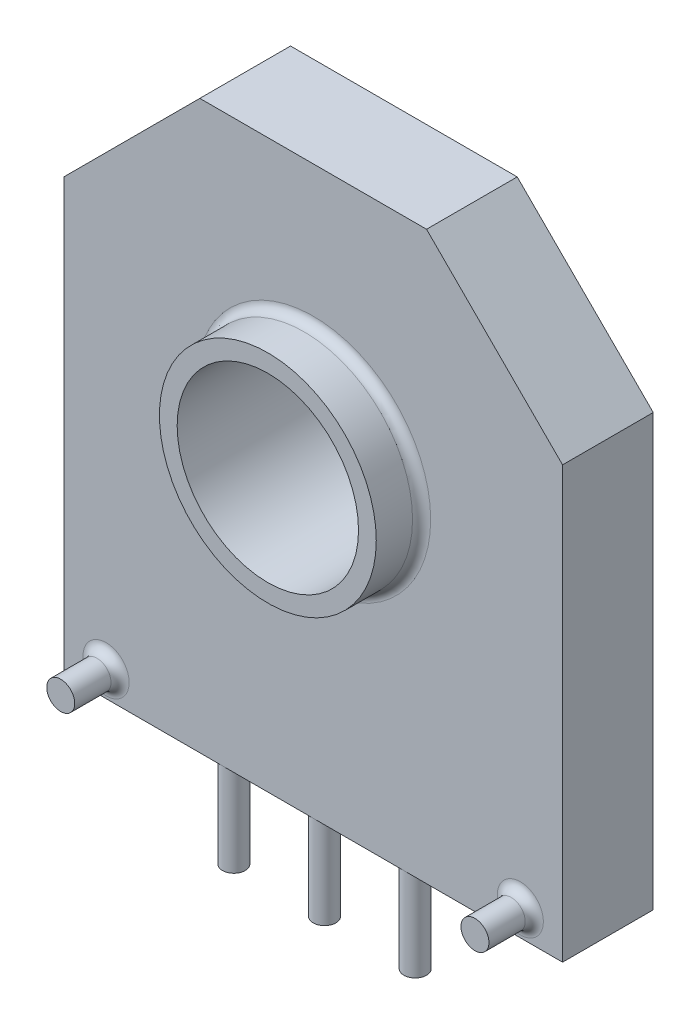
ISO-10303-21;
HEADER;
FILE_DESCRIPTION(('STEP AP214'),'2;1');
FILE_NAME('part.step','',(''),(''),'','','');
FILE_SCHEMA(('AUTOMOTIVE_DESIGN { 1 0 10303 214 1 1 1 1 }'));
ENDSEC;
DATA;
#1=APPLICATION_CONTEXT('core data for automotive mechanical design processes');
#2=APPLICATION_PROTOCOL_DEFINITION('international standard','automotive_design',2000,#1);
#3=PRODUCT_CONTEXT('',#1,'mechanical');
#4=PRODUCT('Part','Part','',(#3));
#5=PRODUCT_RELATED_PRODUCT_CATEGORY('part','',(#4));
#6=PRODUCT_DEFINITION_FORMATION('','',#4);
#7=PRODUCT_DEFINITION_CONTEXT('part definition',#1,'design');
#8=PRODUCT_DEFINITION('design','',#6,#7);
#9=PRODUCT_DEFINITION_SHAPE('','',#8);
#10=(LENGTH_UNIT() NAMED_UNIT(*) SI_UNIT(.MILLI.,.METRE.));
#11=(NAMED_UNIT(*) PLANE_ANGLE_UNIT() SI_UNIT($,.RADIAN.));
#12=(NAMED_UNIT(*) SI_UNIT($,.STERADIAN.) SOLID_ANGLE_UNIT());
#13=UNCERTAINTY_MEASURE_WITH_UNIT(LENGTH_MEASURE(1.E-05),#10,'distance_accuracy_value','');
#14=(GEOMETRIC_REPRESENTATION_CONTEXT(3) GLOBAL_UNCERTAINTY_ASSIGNED_CONTEXT((#13)) GLOBAL_UNIT_ASSIGNED_CONTEXT((#10,
#11,#12)) REPRESENTATION_CONTEXT('',''));
#15=CARTESIAN_POINT('',(0.,0.,0.));
#16=DIRECTION('',(0.,0.,1.));
#17=DIRECTION('',(1.,0.,0.));
#18=AXIS2_PLACEMENT_3D('',#15,#16,#17);
#19=CARTESIAN_POINT('',(0.,0.,2.));
#20=DIRECTION('',(0.,0.,1.));
#21=DIRECTION('',(1.,0.,0.));
#22=AXIS2_PLACEMENT_3D('',#19,#20,#21);
#23=PLANE('',#22);
#24=CARTESIAN_POINT('',(4.56778137063752,-6.43744793052759,2.));
#25=DIRECTION('',(0.,0.,1.));
#26=DIRECTION('',(1.,0.,0.));
#27=AXIS2_PLACEMENT_3D('',#24,#25,#26);
#28=CIRCLE('',#27,0.508853544633855);
#29=CARTESIAN_POINT('',(5.07663491527137,-6.43744793052759,2.));
#30=VERTEX_POINT('',#29);
#31=EDGE_CURVE('E159',#30,#30,#28,.F.);
#32=ORIENTED_EDGE('',*,*,#31,.T.);
#33=EDGE_LOOP('',(#32));
#34=FACE_BOUND('',#33,.T.);
#35=CARTESIAN_POINT('',(-4.56778137063752,-6.43744793052759,2.));
#36=DIRECTION('',(0.,0.,1.));
#37=DIRECTION('',(1.,0.,0.));
#38=AXIS2_PLACEMENT_3D('',#35,#36,#37);
#39=CIRCLE('',#38,0.508853544633855);
#40=CARTESIAN_POINT('',(-4.05892782600366,-6.43744793052759,2.));
#41=VERTEX_POINT('',#40);
#42=EDGE_CURVE('E156',#41,#41,#39,.F.);
#43=ORIENTED_EDGE('',*,*,#42,.T.);
#44=EDGE_LOOP('',(#43));
#45=FACE_BOUND('',#44,.T.);
#46=CARTESIAN_POINT('',(0.,0.,2.));
#47=DIRECTION('',(0.,0.,1.));
#48=DIRECTION('',(1.,0.,0.));
#49=AXIS2_PLACEMENT_3D('',#46,#47,#48);
#50=CIRCLE('',#49,2.59147336487381);
#51=CARTESIAN_POINT('',(2.59147336487381,0.,2.));
#52=VERTEX_POINT('',#51);
#53=EDGE_CURVE('E153',#52,#52,#50,.F.);
#54=ORIENTED_EDGE('',*,*,#53,.T.);
#55=EDGE_LOOP('',(#54));
#56=FACE_BOUND('',#55,.T.);
#57=DIRECTION('',(0.,1.,0.));
#58=VECTOR('',#57,1.);
#59=CARTESIAN_POINT('',(5.5,2.50000000000003,2.));
#60=LINE('',#59,#58);
#61=CARTESIAN_POINT('',(5.5,-7.,2.));
#62=VERTEX_POINT('',#61);
#63=CARTESIAN_POINT('',(5.5,2.50000000000003,2.));
#64=VERTEX_POINT('',#63);
#65=EDGE_CURVE('E141',#62,#64,#60,.T.);
#66=ORIENTED_EDGE('',*,*,#65,.T.);
#67=DIRECTION('',(-0.707106781186552,0.707106781186544,0.));
#68=VECTOR('',#67,1.);
#69=CARTESIAN_POINT('',(2.5,5.5,2.));
#70=LINE('',#69,#68);
#71=CARTESIAN_POINT('',(2.5,5.5,2.));
#72=VERTEX_POINT('',#71);
#73=EDGE_CURVE('E89',#64,#72,#70,.T.);
#74=ORIENTED_EDGE('',*,*,#73,.T.);
#75=DIRECTION('',(-1.,0.,0.));
#76=VECTOR('',#75,1.);
#77=CARTESIAN_POINT('',(2.5,5.5,2.));
#78=LINE('',#77,#76);
#79=CARTESIAN_POINT('',(-2.5,5.5,2.));
#80=VERTEX_POINT('',#79);
#81=EDGE_CURVE('E105',#72,#80,#78,.T.);
#82=ORIENTED_EDGE('',*,*,#81,.T.);
#83=DIRECTION('',(-0.707106781186542,-0.707106781186553,0.));
#84=VECTOR('',#83,1.);
#85=CARTESIAN_POINT('',(-2.5,5.5,2.));
#86=LINE('',#85,#84);
#87=CARTESIAN_POINT('',(-5.5,2.49999999999995,2.));
#88=VERTEX_POINT('',#87);
#89=EDGE_CURVE('E98',#80,#88,#86,.T.);
#90=ORIENTED_EDGE('',*,*,#89,.T.);
#91=DIRECTION('',(0.,-1.,0.));
#92=VECTOR('',#91,1.);
#93=CARTESIAN_POINT('',(-5.5,2.49999999999995,2.));
#94=LINE('',#93,#92);
#95=CARTESIAN_POINT('',(-5.5,-7.,2.));
#96=VERTEX_POINT('',#95);
#97=EDGE_CURVE('E102',#88,#96,#94,.T.);
#98=ORIENTED_EDGE('',*,*,#97,.T.);
#99=DIRECTION('',(1.,0.,0.));
#100=VECTOR('',#99,1.);
#101=CARTESIAN_POINT('',(-5.5,-7.,2.));
#102=LINE('',#101,#100);
#103=CARTESIAN_POINT('',(-2.00000000000001,-7.,1.99999999999997));
#104=VERTEX_POINT('',#103);
#105=EDGE_CURVE('E126',#96,#104,#102,.T.);
#106=ORIENTED_EDGE('',*,*,#105,.T.);
#107=CARTESIAN_POINT('',(0.,-7.,2.));
#108=VERTEX_POINT('',#107);
#109=EDGE_CURVE('E124',#104,#108,#102,.T.);
#110=ORIENTED_EDGE('',*,*,#109,.T.);
#111=CARTESIAN_POINT('',(2.,-7.,2.00000000000003));
#112=VERTEX_POINT('',#111);
#113=EDGE_CURVE('E122',#108,#112,#102,.T.);
#114=ORIENTED_EDGE('',*,*,#113,.T.);
#115=EDGE_CURVE('E51',#112,#62,#102,.T.);
#116=ORIENTED_EDGE('',*,*,#115,.T.);
#117=EDGE_LOOP('',(#66,#74,#82,#90,#98,#106,#110,#114,#116));
#118=FACE_BOUND('',#117,.T.);
#119=ADVANCED_FACE('F34',(#34,#45,#56,#118),#23,.T.);
#120=CARTESIAN_POINT('',(0.,0.,0.));
#121=DIRECTION('',(0.,0.,1.));
#122=DIRECTION('',(1.,0.,0.));
#123=AXIS2_PLACEMENT_3D('',#120,#121,#122);
#124=PLANE('',#123);
#125=DIRECTION('',(0.,1.,0.));
#126=VECTOR('',#125,1.);
#127=CARTESIAN_POINT('',(5.5,2.50000000000003,0.));
#128=LINE('',#127,#126);
#129=CARTESIAN_POINT('',(5.5,-7.,0.));
#130=VERTEX_POINT('',#129);
#131=CARTESIAN_POINT('',(5.5,2.50000000000003,0.));
#132=VERTEX_POINT('',#131);
#133=EDGE_CURVE('E129',#130,#132,#128,.T.);
#134=ORIENTED_EDGE('',*,*,#133,.F.);
#135=DIRECTION('',(1.,0.,0.));
#136=VECTOR('',#135,1.);
#137=CARTESIAN_POINT('',(0.,-7.,0.));
#138=LINE('',#137,#136);
#139=CARTESIAN_POINT('',(-5.5,-7.,0.));
#140=VERTEX_POINT('',#139);
#141=EDGE_CURVE('E76',#140,#130,#138,.T.);
#142=ORIENTED_EDGE('',*,*,#141,.F.);
#143=DIRECTION('',(0.,-1.,0.));
#144=VECTOR('',#143,1.);
#145=CARTESIAN_POINT('',(-5.5,2.49999999999995,0.));
#146=LINE('',#145,#144);
#147=CARTESIAN_POINT('',(-5.5,2.49999999999995,0.));
#148=VERTEX_POINT('',#147);
#149=EDGE_CURVE('E138',#148,#140,#146,.T.);
#150=ORIENTED_EDGE('',*,*,#149,.F.);
#151=DIRECTION('',(-0.707106781186542,-0.707106781186553,0.));
#152=VECTOR('',#151,1.);
#153=CARTESIAN_POINT('',(-2.5,5.5,0.));
#154=LINE('',#153,#152);
#155=CARTESIAN_POINT('',(-2.5,5.5,0.));
#156=VERTEX_POINT('',#155);
#157=EDGE_CURVE('E114',#156,#148,#154,.T.);
#158=ORIENTED_EDGE('',*,*,#157,.F.);
#159=DIRECTION('',(-1.,0.,0.));
#160=VECTOR('',#159,1.);
#161=CARTESIAN_POINT('',(2.5,5.5,0.));
#162=LINE('',#161,#160);
#163=CARTESIAN_POINT('',(2.5,5.5,0.));
#164=VERTEX_POINT('',#163);
#165=EDGE_CURVE('E135',#164,#156,#162,.T.);
#166=ORIENTED_EDGE('',*,*,#165,.F.);
#167=DIRECTION('',(-0.707106781186552,0.707106781186544,0.));
#168=VECTOR('',#167,1.);
#169=CARTESIAN_POINT('',(2.5,5.5,0.));
#170=LINE('',#169,#168);
#171=EDGE_CURVE('E132',#132,#164,#170,.T.);
#172=ORIENTED_EDGE('',*,*,#171,.F.);
#173=EDGE_LOOP('',(#134,#142,#150,#158,#166,#172));
#174=FACE_BOUND('',#173,.T.);
#175=CARTESIAN_POINT('',(0.,0.,0.));
#176=DIRECTION('',(0.,0.,1.));
#177=DIRECTION('',(1.,0.,0.));
#178=AXIS2_PLACEMENT_3D('',#175,#176,#177);
#179=CIRCLE('',#178,2.);
#180=CARTESIAN_POINT('',(2.,0.,0.));
#181=VERTEX_POINT('',#180);
#182=EDGE_CURVE('E133',#181,#181,#179,.T.);
#183=ORIENTED_EDGE('',*,*,#182,.T.);
#184=EDGE_LOOP('',(#183));
#185=FACE_BOUND('',#184,.T.);
#186=ADVANCED_FACE('F182',(#174,#185),#124,.F.);
#187=CARTESIAN_POINT('',(5.5,2.50000000000003,2.));
#188=DIRECTION('',(-1.,0.,0.));
#189=DIRECTION('',(0.,0.,1.));
#190=AXIS2_PLACEMENT_3D('',#187,#188,#189);
#191=PLANE('',#190);
#192=ORIENTED_EDGE('',*,*,#133,.T.);
#193=DIRECTION('',(0.,0.,-1.));
#194=VECTOR('',#193,1.);
#195=CARTESIAN_POINT('',(5.5,2.50000000000003,2.));
#196=LINE('',#195,#194);
#197=EDGE_CURVE('E148',#64,#132,#196,.T.);
#198=ORIENTED_EDGE('',*,*,#197,.F.);
#199=ORIENTED_EDGE('',*,*,#65,.F.);
#200=DIRECTION('',(0.,0.,-1.));
#201=VECTOR('',#200,1.);
#202=CARTESIAN_POINT('',(5.5,-7.,2.));
#203=LINE('',#202,#201);
#204=EDGE_CURVE('E128',#62,#130,#203,.T.);
#205=ORIENTED_EDGE('',*,*,#204,.T.);
#206=EDGE_LOOP('',(#192,#198,#199,#205));
#207=FACE_BOUND('',#206,.T.);
#208=ADVANCED_FACE('F188',(#207),#191,.F.);
#209=CARTESIAN_POINT('',(2.5,5.5,2.));
#210=DIRECTION('',(-0.707106781186543,-0.707106781186552,0.));
#211=DIRECTION('',(0.707106781186552,-0.707106781186543,0.));
#212=AXIS2_PLACEMENT_3D('',#209,#210,#211);
#213=PLANE('',#212);
#214=ORIENTED_EDGE('',*,*,#171,.T.);
#215=DIRECTION('',(0.,0.,-1.));
#216=VECTOR('',#215,1.);
#217=CARTESIAN_POINT('',(2.5,5.5,2.));
#218=LINE('',#217,#216);
#219=EDGE_CURVE('E145',#72,#164,#218,.T.);
#220=ORIENTED_EDGE('',*,*,#219,.F.);
#221=ORIENTED_EDGE('',*,*,#73,.F.);
#222=ORIENTED_EDGE('',*,*,#197,.T.);
#223=EDGE_LOOP('',(#214,#220,#221,#222));
#224=FACE_BOUND('',#223,.T.);
#225=ADVANCED_FACE('F205',(#224),#213,.F.);
#226=CARTESIAN_POINT('',(2.5,5.5,2.));
#227=DIRECTION('',(0.,-1.,0.));
#228=DIRECTION('',(1.,0.,0.));
#229=AXIS2_PLACEMENT_3D('',#226,#227,#228);
#230=PLANE('',#229);
#231=ORIENTED_EDGE('',*,*,#165,.T.);
#232=DIRECTION('',(0.,0.,-1.));
#233=VECTOR('',#232,1.);
#234=CARTESIAN_POINT('',(-2.5,5.5,2.));
#235=LINE('',#234,#233);
#236=EDGE_CURVE('E116',#80,#156,#235,.T.);
#237=ORIENTED_EDGE('',*,*,#236,.F.);
#238=ORIENTED_EDGE('',*,*,#81,.F.);
#239=ORIENTED_EDGE('',*,*,#219,.T.);
#240=EDGE_LOOP('',(#231,#237,#238,#239));
#241=FACE_BOUND('',#240,.T.);
#242=ADVANCED_FACE('F202',(#241),#230,.F.);
#243=CARTESIAN_POINT('',(-2.5,5.5,2.));
#244=DIRECTION('',(0.707106781186554,-0.707106781186542,0.));
#245=DIRECTION('',(0.707106781186542,0.707106781186554,0.));
#246=AXIS2_PLACEMENT_3D('',#243,#244,#245);
#247=PLANE('',#246);
#248=ORIENTED_EDGE('',*,*,#157,.T.);
#249=DIRECTION('',(0.,0.,-1.));
#250=VECTOR('',#249,1.);
#251=CARTESIAN_POINT('',(-5.5,2.49999999999995,2.));
#252=LINE('',#251,#250);
#253=EDGE_CURVE('E111',#88,#148,#252,.T.);
#254=ORIENTED_EDGE('',*,*,#253,.F.);
#255=ORIENTED_EDGE('',*,*,#89,.F.);
#256=ORIENTED_EDGE('',*,*,#236,.T.);
#257=EDGE_LOOP('',(#248,#254,#255,#256));
#258=FACE_BOUND('',#257,.T.);
#259=ADVANCED_FACE('F112',(#258),#247,.F.);
#260=CARTESIAN_POINT('',(-5.5,2.49999999999995,2.));
#261=DIRECTION('',(1.,0.,0.));
#262=DIRECTION('',(0.,0.,-1.));
#263=AXIS2_PLACEMENT_3D('',#260,#261,#262);
#264=PLANE('',#263);
#265=ORIENTED_EDGE('',*,*,#149,.T.);
#266=DIRECTION('',(0.,0.,-1.));
#267=VECTOR('',#266,1.);
#268=CARTESIAN_POINT('',(-5.5,-7.,2.));
#269=LINE('',#268,#267);
#270=EDGE_CURVE('E117',#96,#140,#269,.T.);
#271=ORIENTED_EDGE('',*,*,#270,.F.);
#272=ORIENTED_EDGE('',*,*,#97,.F.);
#273=ORIENTED_EDGE('',*,*,#253,.T.);
#274=EDGE_LOOP('',(#265,#271,#272,#273));
#275=FACE_BOUND('',#274,.T.);
#276=ADVANCED_FACE('F119',(#275),#264,.F.);
#277=CARTESIAN_POINT('',(0.,-7.,2.));
#278=DIRECTION('',(0.,1.,0.));
#279=DIRECTION('',(0.,0.,1.));
#280=AXIS2_PLACEMENT_3D('',#277,#278,#279);
#281=PLANE('',#280);
#282=ORIENTED_EDGE('',*,*,#109,.F.);
#283=CARTESIAN_POINT('',(-2.00000000000001,-7.,1.74999999999997));
#284=DIRECTION('',(0.,-1.,0.));
#285=DIRECTION('',(-1.,0.,0.));
#286=AXIS2_PLACEMENT_3D('',#283,#284,#285);
#287=CIRCLE('',#286,0.25);
#288=EDGE_CURVE('E247',#104,#104,#287,.T.);
#289=ORIENTED_EDGE('',*,*,#288,.F.);
#290=ORIENTED_EDGE('',*,*,#105,.F.);
#291=ORIENTED_EDGE('',*,*,#270,.T.);
#292=ORIENTED_EDGE('',*,*,#141,.T.);
#293=ORIENTED_EDGE('',*,*,#204,.F.);
#294=ORIENTED_EDGE('',*,*,#115,.F.);
#295=CARTESIAN_POINT('',(2.,-7.,1.75000000000003));
#296=DIRECTION('',(0.,-1.,0.));
#297=DIRECTION('',(1.,0.,0.));
#298=AXIS2_PLACEMENT_3D('',#295,#296,#297);
#299=CIRCLE('',#298,0.25);
#300=EDGE_CURVE('E241',#112,#112,#299,.T.);
#301=ORIENTED_EDGE('',*,*,#300,.F.);
#302=ORIENTED_EDGE('',*,*,#113,.F.);
#303=CARTESIAN_POINT('',(0.,-7.,1.75));
#304=DIRECTION('',(0.,-1.,0.));
#305=DIRECTION('',(1.,0.,0.));
#306=AXIS2_PLACEMENT_3D('',#303,#304,#305);
#307=CIRCLE('',#306,0.25);
#308=EDGE_CURVE('E235',#108,#108,#307,.T.);
#309=ORIENTED_EDGE('',*,*,#308,.F.);
#310=EDGE_LOOP('',(#282,#289,#290,#291,#292,#293,#294,#301,#302,#309));
#311=FACE_BOUND('',#310,.T.);
#312=ADVANCED_FACE('F195',(#311),#281,.F.);
#313=CARTESIAN_POINT('',(0.,0.,2.));
#314=DIRECTION('',(0.,0.,-1.));
#315=DIRECTION('',(-1.,0.,0.));
#316=AXIS2_PLACEMENT_3D('',#313,#314,#315);
#317=CYLINDRICAL_SURFACE('',#316,2.);
#318=ORIENTED_EDGE('',*,*,#182,.F.);
#319=EDGE_LOOP('',(#318));
#320=FACE_BOUND('',#319,.T.);
#321=CARTESIAN_POINT('',(0.,0.,3.));
#322=DIRECTION('',(0.,0.,1.));
#323=DIRECTION('',(1.,0.,0.));
#324=AXIS2_PLACEMENT_3D('',#321,#322,#323);
#325=CIRCLE('',#324,2.);
#326=CARTESIAN_POINT('',(2.,0.,3.));
#327=VERTEX_POINT('',#326);
#328=EDGE_CURVE('E225',#327,#327,#325,.T.);
#329=ORIENTED_EDGE('',*,*,#328,.T.);
#330=EDGE_LOOP('',(#329));
#331=FACE_BOUND('',#330,.T.);
#332=ADVANCED_FACE('F192',(#320,#331),#317,.F.);
#333=CARTESIAN_POINT('',(0.,0.,3.));
#334=DIRECTION('',(0.,0.,1.));
#335=DIRECTION('',(1.,0.,0.));
#336=AXIS2_PLACEMENT_3D('',#333,#334,#335);
#337=PLANE('',#336);
#338=CARTESIAN_POINT('',(0.,0.,3.));
#339=DIRECTION('',(0.,0.,1.));
#340=DIRECTION('',(1.,0.,0.));
#341=AXIS2_PLACEMENT_3D('',#338,#339,#340);
#342=CIRCLE('',#341,2.39147336487381);
#343=CARTESIAN_POINT('',(2.39147336487381,0.,3.));
#344=VERTEX_POINT('',#343);
#345=EDGE_CURVE('E222',#344,#344,#342,.T.);
#346=ORIENTED_EDGE('',*,*,#345,.T.);
#347=EDGE_LOOP('',(#346));
#348=FACE_BOUND('',#347,.T.);
#349=ORIENTED_EDGE('',*,*,#328,.F.);
#350=EDGE_LOOP('',(#349));
#351=FACE_BOUND('',#350,.T.);
#352=ADVANCED_FACE('F302',(#348,#351),#337,.T.);
#353=CARTESIAN_POINT('',(0.,0.,3.));
#354=DIRECTION('',(0.,0.,-1.));
#355=DIRECTION('',(-1.,0.,0.));
#356=AXIS2_PLACEMENT_3D('',#353,#354,#355);
#357=CYLINDRICAL_SURFACE('',#356,2.39147336487381);
#358=CARTESIAN_POINT('',(0.,0.,2.2));
#359=DIRECTION('',(0.,0.,1.));
#360=DIRECTION('',(1.,0.,0.));
#361=AXIS2_PLACEMENT_3D('',#358,#359,#360);
#362=CIRCLE('',#361,2.39147336487381);
#363=CARTESIAN_POINT('',(2.39147336487381,0.,2.2));
#364=VERTEX_POINT('',#363);
#365=EDGE_CURVE('E11',#364,#364,#362,.T.);
#366=ORIENTED_EDGE('',*,*,#365,.T.);
#367=EDGE_LOOP('',(#366));
#368=FACE_BOUND('',#367,.T.);
#369=ORIENTED_EDGE('',*,*,#345,.F.);
#370=EDGE_LOOP('',(#369));
#371=FACE_BOUND('',#370,.T.);
#372=ADVANCED_FACE('F301',(#368,#371),#357,.T.);
#373=CARTESIAN_POINT('',(-4.56778137063752,-6.43744793052759,3.));
#374=DIRECTION('',(0.,0.,-1.));
#375=DIRECTION('',(-1.,0.,0.));
#376=AXIS2_PLACEMENT_3D('',#373,#374,#375);
#377=CYLINDRICAL_SURFACE('',#376,0.308853544633855);
#378=CARTESIAN_POINT('',(-4.56778137063752,-6.43744793052759,2.2));
#379=DIRECTION('',(0.,0.,1.));
#380=DIRECTION('',(1.,0.,0.));
#381=AXIS2_PLACEMENT_3D('',#378,#379,#380);
#382=CIRCLE('',#381,0.308853544633855);
#383=CARTESIAN_POINT('',(-4.25892782600366,-6.43744793052759,2.2));
#384=VERTEX_POINT('',#383);
#385=EDGE_CURVE('E43',#384,#384,#382,.T.);
#386=ORIENTED_EDGE('',*,*,#385,.T.);
#387=EDGE_LOOP('',(#386));
#388=FACE_BOUND('',#387,.T.);
#389=CARTESIAN_POINT('',(-4.56778137063752,-6.43744793052759,3.));
#390=DIRECTION('',(0.,0.,1.));
#391=DIRECTION('',(1.,0.,0.));
#392=AXIS2_PLACEMENT_3D('',#389,#390,#391);
#393=CIRCLE('',#392,0.308853544633855);
#394=CARTESIAN_POINT('',(-4.25892782600366,-6.43744793052759,3.));
#395=VERTEX_POINT('',#394);
#396=EDGE_CURVE('E228',#395,#395,#393,.T.);
#397=ORIENTED_EDGE('',*,*,#396,.F.);
#398=EDGE_LOOP('',(#397));
#399=FACE_BOUND('',#398,.T.);
#400=ADVANCED_FACE('F164',(#388,#399),#377,.T.);
#401=CARTESIAN_POINT('',(-4.56778137063752,-6.43744793052759,3.));
#402=DIRECTION('',(0.,0.,1.));
#403=DIRECTION('',(1.,0.,0.));
#404=AXIS2_PLACEMENT_3D('',#401,#402,#403);
#405=PLANE('',#404);
#406=ORIENTED_EDGE('',*,*,#396,.T.);
#407=EDGE_LOOP('',(#406));
#408=FACE_BOUND('',#407,.T.);
#409=ADVANCED_FACE('F294',(#408),#405,.T.);
#410=CARTESIAN_POINT('',(4.56778137063752,-6.43744793052759,3.));
#411=DIRECTION('',(0.,0.,-1.));
#412=DIRECTION('',(-1.,0.,0.));
#413=AXIS2_PLACEMENT_3D('',#410,#411,#412);
#414=CYLINDRICAL_SURFACE('',#413,0.308853544633855);
#415=CARTESIAN_POINT('',(4.56778137063752,-6.43744793052759,2.2));
#416=DIRECTION('',(0.,0.,1.));
#417=DIRECTION('',(1.,0.,0.));
#418=AXIS2_PLACEMENT_3D('',#415,#416,#417);
#419=CIRCLE('',#418,0.308853544633855);
#420=CARTESIAN_POINT('',(4.87663491527137,-6.43744793052759,2.2));
#421=VERTEX_POINT('',#420);
#422=EDGE_CURVE('E150',#421,#421,#419,.T.);
#423=ORIENTED_EDGE('',*,*,#422,.T.);
#424=EDGE_LOOP('',(#423));
#425=FACE_BOUND('',#424,.T.);
#426=CARTESIAN_POINT('',(4.56778137063752,-6.43744793052759,3.));
#427=DIRECTION('',(0.,0.,1.));
#428=DIRECTION('',(-1.,0.,0.));
#429=AXIS2_PLACEMENT_3D('',#426,#427,#428);
#430=CIRCLE('',#429,0.308853544633855);
#431=CARTESIAN_POINT('',(4.25892782600366,-6.43744793052759,3.));
#432=VERTEX_POINT('',#431);
#433=EDGE_CURVE('E231',#432,#432,#430,.T.);
#434=ORIENTED_EDGE('',*,*,#433,.F.);
#435=EDGE_LOOP('',(#434));
#436=FACE_BOUND('',#435,.T.);
#437=ADVANCED_FACE('F290',(#425,#436),#414,.T.);
#438=CARTESIAN_POINT('',(4.56778137063752,-6.43744793052759,3.));
#439=DIRECTION('',(0.,0.,-1.));
#440=DIRECTION('',(-1.,0.,0.));
#441=AXIS2_PLACEMENT_3D('',#438,#439,#440);
#442=PLANE('',#441);
#443=ORIENTED_EDGE('',*,*,#433,.T.);
#444=EDGE_LOOP('',(#443));
#445=FACE_BOUND('',#444,.T.);
#446=ADVANCED_FACE('F177',(#445),#442,.F.);
#447=CARTESIAN_POINT('',(4.56778137063752,-6.43744793052759,2.2));
#448=DIRECTION('',(0.,0.,1.));
#449=DIRECTION('',(1.,0.,0.));
#450=AXIS2_PLACEMENT_3D('',#447,#448,#449);
#451=TOROIDAL_SURFACE('',#450,0.508853544633855,0.2);
#452=ORIENTED_EDGE('',*,*,#31,.F.);
#453=EDGE_LOOP('',(#452));
#454=FACE_BOUND('',#453,.T.);
#455=ORIENTED_EDGE('',*,*,#422,.F.);
#456=EDGE_LOOP('',(#455));
#457=FACE_BOUND('',#456,.T.);
#458=ADVANCED_FACE('F169',(#454,#457),#451,.F.);
#459=CARTESIAN_POINT('',(-4.56778137063752,-6.43744793052759,2.2));
#460=DIRECTION('',(0.,0.,1.));
#461=DIRECTION('',(1.,0.,0.));
#462=AXIS2_PLACEMENT_3D('',#459,#460,#461);
#463=TOROIDAL_SURFACE('',#462,0.508853544633855,0.2);
#464=ORIENTED_EDGE('',*,*,#42,.F.);
#465=EDGE_LOOP('',(#464));
#466=FACE_BOUND('',#465,.T.);
#467=ORIENTED_EDGE('',*,*,#385,.F.);
#468=EDGE_LOOP('',(#467));
#469=FACE_BOUND('',#468,.T.);
#470=ADVANCED_FACE('F167',(#466,#469),#463,.F.);
#471=CARTESIAN_POINT('',(0.,0.,2.2));
#472=DIRECTION('',(0.,0.,1.));
#473=DIRECTION('',(1.,0.,0.));
#474=AXIS2_PLACEMENT_3D('',#471,#472,#473);
#475=TOROIDAL_SURFACE('',#474,2.59147336487381,0.2);
#476=ORIENTED_EDGE('',*,*,#53,.F.);
#477=EDGE_LOOP('',(#476));
#478=FACE_BOUND('',#477,.T.);
#479=ORIENTED_EDGE('',*,*,#365,.F.);
#480=EDGE_LOOP('',(#479));
#481=FACE_BOUND('',#480,.T.);
#482=ADVANCED_FACE('F36',(#478,#481),#475,.F.);
#483=CARTESIAN_POINT('',(0.,-9.,1.75));
#484=DIRECTION('',(0.,1.,0.));
#485=DIRECTION('',(-1.,0.,0.));
#486=AXIS2_PLACEMENT_3D('',#483,#484,#485);
#487=CYLINDRICAL_SURFACE('',#486,0.25);
#488=CARTESIAN_POINT('',(0.,-9.,1.75));
#489=DIRECTION('',(0.,-1.,0.));
#490=DIRECTION('',(1.,0.,0.));
#491=AXIS2_PLACEMENT_3D('',#488,#489,#490);
#492=CIRCLE('',#491,0.25);
#493=CARTESIAN_POINT('',(0.250000000000003,-9.,1.75));
#494=VERTEX_POINT('',#493);
#495=EDGE_CURVE('E234',#494,#494,#492,.T.);
#496=ORIENTED_EDGE('',*,*,#495,.F.);
#497=EDGE_LOOP('',(#496));
#498=FACE_BOUND('',#497,.T.);
#499=ORIENTED_EDGE('',*,*,#308,.T.);
#500=EDGE_LOOP('',(#499));
#501=FACE_BOUND('',#500,.T.);
#502=ADVANCED_FACE('F175',(#498,#501),#487,.T.);
#503=CARTESIAN_POINT('',(0.,-9.,1.75));
#504=DIRECTION('',(0.,-1.,0.));
#505=DIRECTION('',(1.,0.,0.));
#506=AXIS2_PLACEMENT_3D('',#503,#504,#505);
#507=PLANE('',#506);
#508=ORIENTED_EDGE('',*,*,#495,.T.);
#509=EDGE_LOOP('',(#508));
#510=FACE_BOUND('',#509,.T.);
#511=ADVANCED_FACE('F272',(#510),#507,.T.);
#512=CARTESIAN_POINT('',(2.,-9.,1.75000000000003));
#513=DIRECTION('',(0.,1.,0.));
#514=DIRECTION('',(-1.,0.,0.));
#515=AXIS2_PLACEMENT_3D('',#512,#513,#514);
#516=CYLINDRICAL_SURFACE('',#515,0.25);
#517=CARTESIAN_POINT('',(2.,-9.,1.75000000000003));
#518=DIRECTION('',(0.,-1.,0.));
#519=DIRECTION('',(1.,0.,0.));
#520=AXIS2_PLACEMENT_3D('',#517,#518,#519);
#521=CIRCLE('',#520,0.25);
#522=CARTESIAN_POINT('',(2.25,-9.,1.75000000000003));
#523=VERTEX_POINT('',#522);
#524=EDGE_CURVE('E238',#523,#523,#521,.T.);
#525=ORIENTED_EDGE('',*,*,#524,.F.);
#526=EDGE_LOOP('',(#525));
#527=FACE_BOUND('',#526,.T.);
#528=ORIENTED_EDGE('',*,*,#300,.T.);
#529=EDGE_LOOP('',(#528));
#530=FACE_BOUND('',#529,.T.);
#531=ADVANCED_FACE('F270',(#527,#530),#516,.T.);
#532=CARTESIAN_POINT('',(2.,-9.,1.75000000000003));
#533=DIRECTION('',(0.,-1.,0.));
#534=DIRECTION('',(1.,0.,0.));
#535=AXIS2_PLACEMENT_3D('',#532,#533,#534);
#536=PLANE('',#535);
#537=ORIENTED_EDGE('',*,*,#524,.T.);
#538=EDGE_LOOP('',(#537));
#539=FACE_BOUND('',#538,.T.);
#540=ADVANCED_FACE('F258',(#539),#536,.T.);
#541=CARTESIAN_POINT('',(-2.00000000000001,-9.,1.74999999999997));
#542=DIRECTION('',(0.,1.,0.));
#543=DIRECTION('',(-1.,0.,0.));
#544=AXIS2_PLACEMENT_3D('',#541,#542,#543);
#545=CYLINDRICAL_SURFACE('',#544,0.25);
#546=CARTESIAN_POINT('',(-2.00000000000001,-9.,1.74999999999997));
#547=DIRECTION('',(0.,-1.,0.));
#548=DIRECTION('',(-1.,0.,0.));
#549=AXIS2_PLACEMENT_3D('',#546,#547,#548);
#550=CIRCLE('',#549,0.25);
#551=CARTESIAN_POINT('',(-2.25000000000001,-9.,1.74999999999997));
#552=VERTEX_POINT('',#551);
#553=EDGE_CURVE('E244',#552,#552,#550,.T.);
#554=ORIENTED_EDGE('',*,*,#553,.F.);
#555=EDGE_LOOP('',(#554));
#556=FACE_BOUND('',#555,.T.);
#557=ORIENTED_EDGE('',*,*,#288,.T.);
#558=EDGE_LOOP('',(#557));
#559=FACE_BOUND('',#558,.T.);
#560=ADVANCED_FACE('F255',(#556,#559),#545,.T.);
#561=CARTESIAN_POINT('',(-2.00000000000001,-9.,1.74999999999997));
#562=DIRECTION('',(0.,1.,0.));
#563=DIRECTION('',(-1.,0.,0.));
#564=AXIS2_PLACEMENT_3D('',#561,#562,#563);
#565=PLANE('',#564);
#566=ORIENTED_EDGE('',*,*,#553,.T.);
#567=EDGE_LOOP('',(#566));
#568=FACE_BOUND('',#567,.T.);
#569=ADVANCED_FACE('F253',(#568),#565,.F.);
#570=CLOSED_SHELL('',(#119,#186,#208,#225,#242,#259,#276,#312,#332,#352,#372,#400,#409,#437,
#446,#458,#470,#482,#502,#511,#531,#540,#560,#569));
#571=MANIFOLD_SOLID_BREP('B2',#570);
#572=ADVANCED_BREP_SHAPE_REPRESENTATION('',(#18,#571),#14);
#573=SHAPE_DEFINITION_REPRESENTATION(#9,#572);
ENDSEC;
END-ISO-10303-21;
